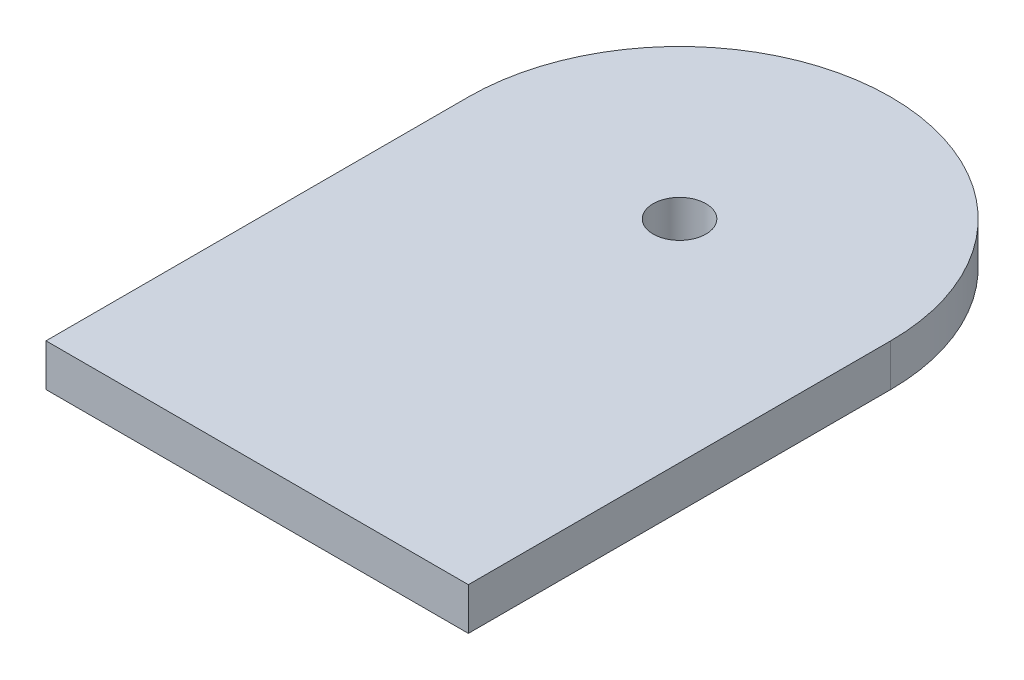
ISO-10303-21;
HEADER;
FILE_DESCRIPTION(('STEP AP214'),'2;1');
FILE_NAME('part.step','',(''),(''),'','','');
FILE_SCHEMA(('AUTOMOTIVE_DESIGN { 1 0 10303 214 1 1 1 1 }'));
ENDSEC;
DATA;
#1=APPLICATION_CONTEXT('core data for automotive mechanical design processes');
#2=APPLICATION_PROTOCOL_DEFINITION('international standard','automotive_design',2000,#1);
#3=PRODUCT_CONTEXT('',#1,'mechanical');
#4=PRODUCT('Part','Part','',(#3));
#5=PRODUCT_RELATED_PRODUCT_CATEGORY('part','',(#4));
#6=PRODUCT_DEFINITION_FORMATION('','',#4);
#7=PRODUCT_DEFINITION_CONTEXT('part definition',#1,'design');
#8=PRODUCT_DEFINITION('design','',#6,#7);
#9=PRODUCT_DEFINITION_SHAPE('','',#8);
#10=(LENGTH_UNIT() NAMED_UNIT(*) SI_UNIT(.MILLI.,.METRE.));
#11=(NAMED_UNIT(*) PLANE_ANGLE_UNIT() SI_UNIT($,.RADIAN.));
#12=(NAMED_UNIT(*) SI_UNIT($,.STERADIAN.) SOLID_ANGLE_UNIT());
#13=UNCERTAINTY_MEASURE_WITH_UNIT(LENGTH_MEASURE(1.E-05),#10,'distance_accuracy_value','');
#14=(GEOMETRIC_REPRESENTATION_CONTEXT(3) GLOBAL_UNCERTAINTY_ASSIGNED_CONTEXT((#13)) GLOBAL_UNIT_ASSIGNED_CONTEXT((#10,
#11,#12)) REPRESENTATION_CONTEXT('',''));
#15=CARTESIAN_POINT('',(0.,0.,0.));
#16=DIRECTION('',(0.,0.,1.));
#17=DIRECTION('',(1.,0.,0.));
#18=AXIS2_PLACEMENT_3D('',#15,#16,#17);
#19=CARTESIAN_POINT('',(40.,8.,-80.));
#20=DIRECTION('',(0.,1.,0.));
#21=DIRECTION('',(0.,0.,1.));
#22=AXIS2_PLACEMENT_3D('',#19,#20,#21);
#23=PLANE('',#22);
#24=DIRECTION('',(0.,0.,1.));
#25=VECTOR('',#24,1.);
#26=CARTESIAN_POINT('',(0.,8.,0.));
#27=LINE('',#26,#25);
#28=CARTESIAN_POINT('',(0.,8.,-80.));
#29=VERTEX_POINT('',#28);
#30=CARTESIAN_POINT('',(0.,8.,0.));
#31=VERTEX_POINT('',#30);
#32=EDGE_CURVE('E92',#29,#31,#27,.T.);
#33=ORIENTED_EDGE('',*,*,#32,.T.);
#34=DIRECTION('',(1.,0.,0.));
#35=VECTOR('',#34,1.);
#36=CARTESIAN_POINT('',(0.,8.,0.));
#37=LINE('',#36,#35);
#38=CARTESIAN_POINT('',(80.,8.,0.));
#39=VERTEX_POINT('',#38);
#40=EDGE_CURVE('E87',#31,#39,#37,.T.);
#41=ORIENTED_EDGE('',*,*,#40,.T.);
#42=DIRECTION('',(0.,0.,-1.));
#43=VECTOR('',#42,1.);
#44=CARTESIAN_POINT('',(80.,8.,0.));
#45=LINE('',#44,#43);
#46=CARTESIAN_POINT('',(80.,8.,-80.));
#47=VERTEX_POINT('',#46);
#48=EDGE_CURVE('E90',#39,#47,#45,.T.);
#49=ORIENTED_EDGE('',*,*,#48,.T.);
#50=CARTESIAN_POINT('',(40.,8.,-80.));
#51=DIRECTION('',(0.,1.,0.));
#52=DIRECTION('',(0.,0.,1.));
#53=AXIS2_PLACEMENT_3D('',#50,#51,#52);
#54=CIRCLE('',#53,40.);
#55=EDGE_CURVE('E57',#47,#29,#54,.T.);
#56=ORIENTED_EDGE('',*,*,#55,.T.);
#57=EDGE_LOOP('',(#33,#41,#49,#56));
#58=FACE_BOUND('',#57,.T.);
#59=CARTESIAN_POINT('',(40.,8.,-80.));
#60=DIRECTION('',(0.,1.,0.));
#61=DIRECTION('',(0.,0.,1.));
#62=AXIS2_PLACEMENT_3D('',#59,#60,#61);
#63=CIRCLE('',#62,5.);
#64=CARTESIAN_POINT('',(40.,8.,-75.));
#65=VERTEX_POINT('',#64);
#66=EDGE_CURVE('E112',#65,#65,#63,.T.);
#67=ORIENTED_EDGE('',*,*,#66,.F.);
#68=EDGE_LOOP('',(#67));
#69=FACE_BOUND('',#68,.T.);
#70=ADVANCED_FACE('F39',(#58,#69),#23,.T.);
#71=CARTESIAN_POINT('',(40.,0.,-80.));
#72=DIRECTION('',(0.,1.,0.));
#73=DIRECTION('',(0.,0.,1.));
#74=AXIS2_PLACEMENT_3D('',#71,#72,#73);
#75=PLANE('',#74);
#76=DIRECTION('',(0.,0.,1.));
#77=VECTOR('',#76,1.);
#78=CARTESIAN_POINT('',(0.,0.,0.));
#79=LINE('',#78,#77);
#80=CARTESIAN_POINT('',(0.,0.,-80.));
#81=VERTEX_POINT('',#80);
#82=CARTESIAN_POINT('',(0.,0.,0.));
#83=VERTEX_POINT('',#82);
#84=EDGE_CURVE('E108',#81,#83,#79,.T.);
#85=ORIENTED_EDGE('',*,*,#84,.F.);
#86=CARTESIAN_POINT('',(40.,0.,-80.));
#87=DIRECTION('',(0.,1.,0.));
#88=DIRECTION('',(0.,0.,1.));
#89=AXIS2_PLACEMENT_3D('',#86,#87,#88);
#90=CIRCLE('',#89,40.);
#91=CARTESIAN_POINT('',(80.,0.,-80.));
#92=VERTEX_POINT('',#91);
#93=EDGE_CURVE('E80',#92,#81,#90,.T.);
#94=ORIENTED_EDGE('',*,*,#93,.F.);
#95=DIRECTION('',(0.,0.,-1.));
#96=VECTOR('',#95,1.);
#97=CARTESIAN_POINT('',(80.,0.,0.));
#98=LINE('',#97,#96);
#99=CARTESIAN_POINT('',(80.,0.,0.));
#100=VERTEX_POINT('',#99);
#101=EDGE_CURVE('E74',#100,#92,#98,.T.);
#102=ORIENTED_EDGE('',*,*,#101,.F.);
#103=DIRECTION('',(1.,0.,0.));
#104=VECTOR('',#103,1.);
#105=CARTESIAN_POINT('',(0.,0.,0.));
#106=LINE('',#105,#104);
#107=EDGE_CURVE('E97',#83,#100,#106,.T.);
#108=ORIENTED_EDGE('',*,*,#107,.F.);
#109=EDGE_LOOP('',(#85,#94,#102,#108));
#110=FACE_BOUND('',#109,.T.);
#111=CARTESIAN_POINT('',(40.,0.,-80.));
#112=DIRECTION('',(0.,1.,0.));
#113=DIRECTION('',(0.,0.,1.));
#114=AXIS2_PLACEMENT_3D('',#111,#112,#113);
#115=CIRCLE('',#114,5.);
#116=CARTESIAN_POINT('',(40.,0.,-75.));
#117=VERTEX_POINT('',#116);
#118=EDGE_CURVE('E130',#117,#117,#115,.T.);
#119=ORIENTED_EDGE('',*,*,#118,.T.);
#120=EDGE_LOOP('',(#119));
#121=FACE_BOUND('',#120,.T.);
#122=ADVANCED_FACE('F125',(#110,#121),#75,.F.);
#123=CARTESIAN_POINT('',(0.,8.,0.));
#124=DIRECTION('',(1.,0.,0.));
#125=DIRECTION('',(0.,0.,-1.));
#126=AXIS2_PLACEMENT_3D('',#123,#124,#125);
#127=PLANE('',#126);
#128=ORIENTED_EDGE('',*,*,#84,.T.);
#129=DIRECTION('',(0.,-1.,0.));
#130=VECTOR('',#129,1.);
#131=CARTESIAN_POINT('',(0.,8.,0.));
#132=LINE('',#131,#130);
#133=EDGE_CURVE('E11',#31,#83,#132,.T.);
#134=ORIENTED_EDGE('',*,*,#133,.F.);
#135=ORIENTED_EDGE('',*,*,#32,.F.);
#136=DIRECTION('',(0.,-1.,0.));
#137=VECTOR('',#136,1.);
#138=CARTESIAN_POINT('',(0.,8.,-80.));
#139=LINE('',#138,#137);
#140=EDGE_CURVE('E104',#29,#81,#139,.T.);
#141=ORIENTED_EDGE('',*,*,#140,.T.);
#142=EDGE_LOOP('',(#128,#134,#135,#141));
#143=FACE_BOUND('',#142,.T.);
#144=ADVANCED_FACE('F41',(#143),#127,.F.);
#145=CARTESIAN_POINT('',(0.,8.,0.));
#146=DIRECTION('',(0.,0.,-1.));
#147=DIRECTION('',(-1.,0.,0.));
#148=AXIS2_PLACEMENT_3D('',#145,#146,#147);
#149=PLANE('',#148);
#150=ORIENTED_EDGE('',*,*,#107,.T.);
#151=DIRECTION('',(0.,-1.,0.));
#152=VECTOR('',#151,1.);
#153=CARTESIAN_POINT('',(80.,8.,0.));
#154=LINE('',#153,#152);
#155=EDGE_CURVE('E49',#39,#100,#154,.T.);
#156=ORIENTED_EDGE('',*,*,#155,.F.);
#157=ORIENTED_EDGE('',*,*,#40,.F.);
#158=ORIENTED_EDGE('',*,*,#133,.T.);
#159=EDGE_LOOP('',(#150,#156,#157,#158));
#160=FACE_BOUND('',#159,.T.);
#161=ADVANCED_FACE('F96',(#160),#149,.F.);
#162=CARTESIAN_POINT('',(80.,8.,0.));
#163=DIRECTION('',(-1.,0.,0.));
#164=DIRECTION('',(0.,0.,1.));
#165=AXIS2_PLACEMENT_3D('',#162,#163,#164);
#166=PLANE('',#165);
#167=ORIENTED_EDGE('',*,*,#101,.T.);
#168=DIRECTION('',(0.,-1.,0.));
#169=VECTOR('',#168,1.);
#170=CARTESIAN_POINT('',(80.,8.,-80.));
#171=LINE('',#170,#169);
#172=EDGE_CURVE('E99',#47,#92,#171,.T.);
#173=ORIENTED_EDGE('',*,*,#172,.F.);
#174=ORIENTED_EDGE('',*,*,#48,.F.);
#175=ORIENTED_EDGE('',*,*,#155,.T.);
#176=EDGE_LOOP('',(#167,#173,#174,#175));
#177=FACE_BOUND('',#176,.T.);
#178=ADVANCED_FACE('F100',(#177),#166,.F.);
#179=CARTESIAN_POINT('',(40.,8.,-80.));
#180=DIRECTION('',(0.,-1.,0.));
#181=DIRECTION('',(0.,0.,-1.));
#182=AXIS2_PLACEMENT_3D('',#179,#180,#181);
#183=CYLINDRICAL_SURFACE('',#182,40.);
#184=ORIENTED_EDGE('',*,*,#93,.T.);
#185=ORIENTED_EDGE('',*,*,#140,.F.);
#186=ORIENTED_EDGE('',*,*,#55,.F.);
#187=ORIENTED_EDGE('',*,*,#172,.T.);
#188=EDGE_LOOP('',(#184,#185,#186,#187));
#189=FACE_BOUND('',#188,.T.);
#190=ADVANCED_FACE('F122',(#189),#183,.T.);
#191=CARTESIAN_POINT('',(40.,8.,-80.));
#192=DIRECTION('',(0.,-1.,0.));
#193=DIRECTION('',(0.,0.,-1.));
#194=AXIS2_PLACEMENT_3D('',#191,#192,#193);
#195=CYLINDRICAL_SURFACE('',#194,5.);
#196=ORIENTED_EDGE('',*,*,#66,.T.);
#197=EDGE_LOOP('',(#196));
#198=FACE_BOUND('',#197,.T.);
#199=ORIENTED_EDGE('',*,*,#118,.F.);
#200=EDGE_LOOP('',(#199));
#201=FACE_BOUND('',#200,.T.);
#202=ADVANCED_FACE('F138',(#198,#201),#195,.F.);
#203=CLOSED_SHELL('',(#70,#122,#144,#161,#178,#190,#202));
#204=MANIFOLD_SOLID_BREP('B2',#203);
#205=ADVANCED_BREP_SHAPE_REPRESENTATION('',(#18,#204),#14);
#206=SHAPE_DEFINITION_REPRESENTATION(#9,#205);
ENDSEC;
END-ISO-10303-21;
